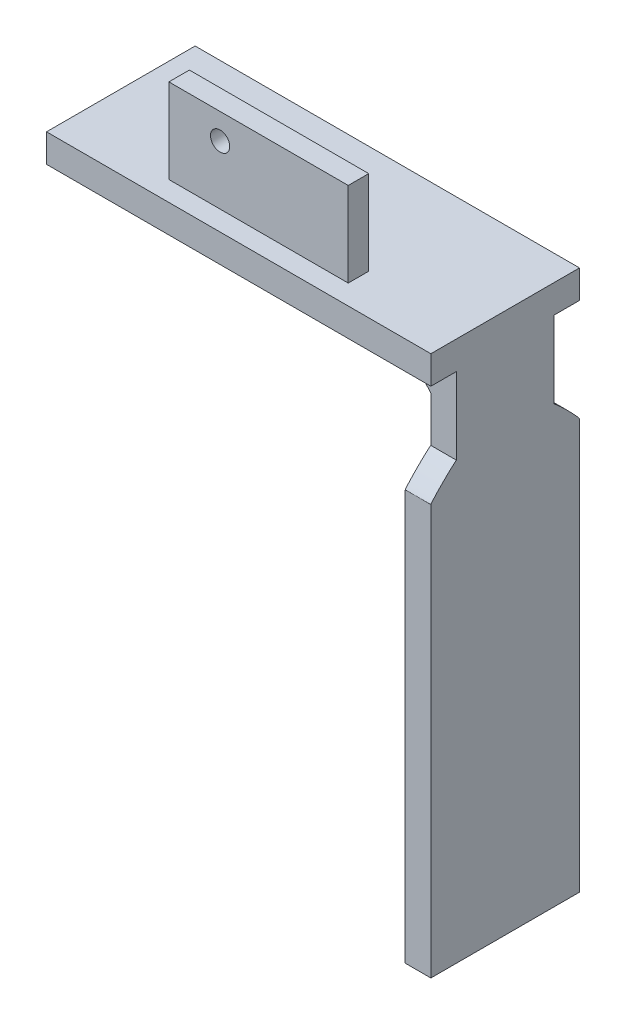
ISO-10303-21;
HEADER;
FILE_DESCRIPTION(('STEP AP214'),'2;1');
FILE_NAME('part.step','',(''),(''),'','','');
FILE_SCHEMA(('AUTOMOTIVE_DESIGN { 1 0 10303 214 1 1 1 1 }'));
ENDSEC;
DATA;
#1=APPLICATION_CONTEXT('core data for automotive mechanical design processes');
#2=APPLICATION_PROTOCOL_DEFINITION('international standard','automotive_design',2000,#1);
#3=PRODUCT_CONTEXT('',#1,'mechanical');
#4=PRODUCT('Part','Part','',(#3));
#5=PRODUCT_RELATED_PRODUCT_CATEGORY('part','',(#4));
#6=PRODUCT_DEFINITION_FORMATION('','',#4);
#7=PRODUCT_DEFINITION_CONTEXT('part definition',#1,'design');
#8=PRODUCT_DEFINITION('design','',#6,#7);
#9=PRODUCT_DEFINITION_SHAPE('','',#8);
#10=(LENGTH_UNIT() NAMED_UNIT(*) SI_UNIT(.MILLI.,.METRE.));
#11=(NAMED_UNIT(*) PLANE_ANGLE_UNIT() SI_UNIT($,.RADIAN.));
#12=(NAMED_UNIT(*) SI_UNIT($,.STERADIAN.) SOLID_ANGLE_UNIT());
#13=UNCERTAINTY_MEASURE_WITH_UNIT(LENGTH_MEASURE(1.E-05),#10,'distance_accuracy_value','');
#14=(GEOMETRIC_REPRESENTATION_CONTEXT(3) GLOBAL_UNCERTAINTY_ASSIGNED_CONTEXT((#13)) GLOBAL_UNIT_ASSIGNED_CONTEXT((#10,
#11,#12)) REPRESENTATION_CONTEXT('',''));
#15=CARTESIAN_POINT('',(0.,0.,0.));
#16=DIRECTION('',(0.,0.,1.));
#17=DIRECTION('',(1.,0.,0.));
#18=AXIS2_PLACEMENT_3D('',#15,#16,#17);
#19=CARTESIAN_POINT('',(0.,0.,0.));
#20=DIRECTION('',(0.,1.,0.));
#21=DIRECTION('',(0.,0.,1.));
#22=AXIS2_PLACEMENT_3D('',#19,#20,#21);
#23=PLANE('',#22);
#24=DIRECTION('',(1.,0.,0.));
#25=VECTOR('',#24,1.);
#26=CARTESIAN_POINT('',(60.,0.,4.));
#27=LINE('',#26,#25);
#28=CARTESIAN_POINT('',(51.,0.,3.99999999999999));
#29=VERTEX_POINT('',#28);
#30=CARTESIAN_POINT('',(60.,0.,4.));
#31=VERTEX_POINT('',#30);
#32=EDGE_CURVE('E186',#29,#31,#27,.T.);
#33=ORIENTED_EDGE('',*,*,#32,.F.);
#34=CARTESIAN_POINT('',(51.,0.,19.96));
#35=CARTESIAN_POINT('',(51.,0.,14.3866666666666));
#36=CARTESIAN_POINT('',(51.,0.,8.81333333333334));
#37=CARTESIAN_POINT('',(51.,0.,3.23999999999999));
#38=(BOUNDED_CURVE() B_SPLINE_CURVE(3,(#34,#35,#36,#37),.UNSPECIFIED.,.F.,
.F.) B_SPLINE_CURVE_WITH_KNOTS((4,4),(-0.000760000000000007,0.01596),
.UNSPECIFIED.) CURVE() GEOMETRIC_REPRESENTATION_ITEM() RATIONAL_B_SPLINE_CURVE((1.,1.,1.,1.)) REPRESENTATION_ITEM(''));
#39=CARTESIAN_POINT('',(51.,0.,19.2));
#40=VERTEX_POINT('',#39);
#41=EDGE_CURVE('E407',#29,#40,#38,.F.);
#42=ORIENTED_EDGE('',*,*,#41,.T.);
#43=DIRECTION('',(-1.,0.,0.));
#44=VECTOR('',#43,1.);
#45=CARTESIAN_POINT('',(60.,0.,19.2));
#46=LINE('',#45,#44);
#47=CARTESIAN_POINT('',(60.,0.,19.2));
#48=VERTEX_POINT('',#47);
#49=EDGE_CURVE('E747',#48,#40,#46,.T.);
#50=ORIENTED_EDGE('',*,*,#49,.F.);
#51=DIRECTION('',(0.,0.,-1.));
#52=VECTOR('',#51,1.);
#53=CARTESIAN_POINT('',(60.,0.,0.));
#54=LINE('',#53,#52);
#55=CARTESIAN_POINT('',(60.,0.,23.2));
#56=VERTEX_POINT('',#55);
#57=EDGE_CURVE('E496',#56,#48,#54,.T.);
#58=ORIENTED_EDGE('',*,*,#57,.F.);
#59=DIRECTION('',(1.,0.,0.));
#60=VECTOR('',#59,1.);
#61=CARTESIAN_POINT('',(0.,0.,23.2));
#62=LINE('',#61,#60);
#63=CARTESIAN_POINT('',(0.,0.,23.2));
#64=VERTEX_POINT('',#63);
#65=EDGE_CURVE('E493',#64,#56,#62,.T.);
#66=ORIENTED_EDGE('',*,*,#65,.F.);
#67=DIRECTION('',(0.,0.,1.));
#68=VECTOR('',#67,1.);
#69=CARTESIAN_POINT('',(0.,0.,0.));
#70=LINE('',#69,#68);
#71=CARTESIAN_POINT('',(0.,0.,0.));
#72=VERTEX_POINT('',#71);
#73=EDGE_CURVE('E479',#72,#64,#70,.T.);
#74=ORIENTED_EDGE('',*,*,#73,.F.);
#75=DIRECTION('',(-1.,0.,0.));
#76=VECTOR('',#75,1.);
#77=CARTESIAN_POINT('',(0.,0.,0.));
#78=LINE('',#77,#76);
#79=CARTESIAN_POINT('',(60.,0.,0.));
#80=VERTEX_POINT('',#79);
#81=EDGE_CURVE('E484',#80,#72,#78,.T.);
#82=ORIENTED_EDGE('',*,*,#81,.F.);
#83=EDGE_CURVE('E495',#31,#80,#54,.T.);
#84=ORIENTED_EDGE('',*,*,#83,.F.);
#85=EDGE_LOOP('',(#33,#42,#50,#58,#66,#74,#82,#84));
#86=FACE_BOUND('',#85,.T.);
#87=ADVANCED_FACE('F38',(#86),#23,.F.);
#88=CARTESIAN_POINT('',(0.,4.4,0.));
#89=DIRECTION('',(0.,1.,0.));
#90=DIRECTION('',(0.,0.,1.));
#91=AXIS2_PLACEMENT_3D('',#88,#89,#90);
#92=PLANE('',#91);
#93=DIRECTION('',(0.,0.,1.));
#94=VECTOR('',#93,1.);
#95=CARTESIAN_POINT('',(0.,4.4,0.));
#96=LINE('',#95,#94);
#97=CARTESIAN_POINT('',(0.,4.4,0.));
#98=VERTEX_POINT('',#97);
#99=CARTESIAN_POINT('',(0.,4.4,23.2));
#100=VERTEX_POINT('',#99);
#101=EDGE_CURVE('E480',#98,#100,#96,.T.);
#102=ORIENTED_EDGE('',*,*,#101,.T.);
#103=DIRECTION('',(1.,0.,0.));
#104=VECTOR('',#103,1.);
#105=CARTESIAN_POINT('',(0.,4.4,23.2));
#106=LINE('',#105,#104);
#107=CARTESIAN_POINT('',(60.,4.4,23.2));
#108=VERTEX_POINT('',#107);
#109=EDGE_CURVE('E483',#100,#108,#106,.T.);
#110=ORIENTED_EDGE('',*,*,#109,.T.);
#111=DIRECTION('',(0.,0.,-1.));
#112=VECTOR('',#111,1.);
#113=CARTESIAN_POINT('',(60.,4.4,0.));
#114=LINE('',#113,#112);
#115=CARTESIAN_POINT('',(60.,4.4,0.));
#116=VERTEX_POINT('',#115);
#117=EDGE_CURVE('E486',#108,#116,#114,.T.);
#118=ORIENTED_EDGE('',*,*,#117,.T.);
#119=DIRECTION('',(-1.,0.,0.));
#120=VECTOR('',#119,1.);
#121=CARTESIAN_POINT('',(0.,4.4,0.));
#122=LINE('',#121,#120);
#123=EDGE_CURVE('E488',#116,#98,#122,.T.);
#124=ORIENTED_EDGE('',*,*,#123,.T.);
#125=EDGE_LOOP('',(#102,#110,#118,#124));
#126=FACE_BOUND('',#125,.T.);
#127=DIRECTION('',(1.,0.,0.));
#128=VECTOR('',#127,1.);
#129=CARTESIAN_POINT('',(16.,4.4,20.1));
#130=LINE('',#129,#128);
#131=CARTESIAN_POINT('',(16.,4.4,20.1));
#132=VERTEX_POINT('',#131);
#133=CARTESIAN_POINT('',(44.,4.4,20.1));
#134=VERTEX_POINT('',#133);
#135=EDGE_CURVE('E452',#132,#134,#130,.T.);
#136=ORIENTED_EDGE('',*,*,#135,.F.);
#137=DIRECTION('',(0.,0.,1.));
#138=VECTOR('',#137,1.);
#139=CARTESIAN_POINT('',(16.,4.4,16.9));
#140=LINE('',#139,#138);
#141=CARTESIAN_POINT('',(16.,4.4,16.9));
#142=VERTEX_POINT('',#141);
#143=EDGE_CURVE('E449',#142,#132,#140,.T.);
#144=ORIENTED_EDGE('',*,*,#143,.F.);
#145=DIRECTION('',(-1.,0.,0.));
#146=VECTOR('',#145,1.);
#147=CARTESIAN_POINT('',(16.,4.4,16.9));
#148=LINE('',#147,#146);
#149=CARTESIAN_POINT('',(44.,4.4,16.9));
#150=VERTEX_POINT('',#149);
#151=EDGE_CURVE('E467',#150,#142,#148,.T.);
#152=ORIENTED_EDGE('',*,*,#151,.F.);
#153=DIRECTION('',(0.,0.,-1.));
#154=VECTOR('',#153,1.);
#155=CARTESIAN_POINT('',(44.,4.4,16.9));
#156=LINE('',#155,#154);
#157=EDGE_CURVE('E459',#134,#150,#156,.T.);
#158=ORIENTED_EDGE('',*,*,#157,.F.);
#159=EDGE_LOOP('',(#136,#144,#152,#158));
#160=FACE_BOUND('',#159,.T.);
#161=ADVANCED_FACE('F420',(#126,#160),#92,.T.);
#162=CARTESIAN_POINT('',(0.,4.4,0.));
#163=DIRECTION('',(1.,0.,0.));
#164=DIRECTION('',(0.,0.,-1.));
#165=AXIS2_PLACEMENT_3D('',#162,#163,#164);
#166=PLANE('',#165);
#167=ORIENTED_EDGE('',*,*,#73,.T.);
#168=DIRECTION('',(0.,-1.,0.));
#169=VECTOR('',#168,1.);
#170=CARTESIAN_POINT('',(0.,4.4,23.2));
#171=LINE('',#170,#169);
#172=EDGE_CURVE('E387',#100,#64,#171,.T.);
#173=ORIENTED_EDGE('',*,*,#172,.F.);
#174=ORIENTED_EDGE('',*,*,#101,.F.);
#175=DIRECTION('',(0.,-1.,0.));
#176=VECTOR('',#175,1.);
#177=CARTESIAN_POINT('',(0.,4.4,0.));
#178=LINE('',#177,#176);
#179=EDGE_CURVE('E490',#98,#72,#178,.T.);
#180=ORIENTED_EDGE('',*,*,#179,.T.);
#181=EDGE_LOOP('',(#167,#173,#174,#180));
#182=FACE_BOUND('',#181,.T.);
#183=ADVANCED_FACE('F628',(#182),#166,.F.);
#184=CARTESIAN_POINT('',(0.,4.4,23.2));
#185=DIRECTION('',(0.,0.,-1.));
#186=DIRECTION('',(-1.,0.,0.));
#187=AXIS2_PLACEMENT_3D('',#184,#185,#186);
#188=PLANE('',#187);
#189=ORIENTED_EDGE('',*,*,#65,.T.);
#190=DIRECTION('',(0.,-1.,0.));
#191=VECTOR('',#190,1.);
#192=CARTESIAN_POINT('',(60.,4.4,23.2));
#193=LINE('',#192,#191);
#194=EDGE_CURVE('E504',#108,#56,#193,.T.);
#195=ORIENTED_EDGE('',*,*,#194,.F.);
#196=ORIENTED_EDGE('',*,*,#109,.F.);
#197=ORIENTED_EDGE('',*,*,#172,.T.);
#198=EDGE_LOOP('',(#189,#195,#196,#197));
#199=FACE_BOUND('',#198,.T.);
#200=ADVANCED_FACE('F430',(#199),#188,.F.);
#201=CARTESIAN_POINT('',(60.,4.4,0.));
#202=DIRECTION('',(-1.,0.,0.));
#203=DIRECTION('',(0.,0.,1.));
#204=AXIS2_PLACEMENT_3D('',#201,#202,#203);
#205=PLANE('',#204);
#206=DIRECTION('',(0.,-1.,0.));
#207=VECTOR('',#206,1.);
#208=CARTESIAN_POINT('',(60.,-80.,0.));
#209=LINE('',#208,#207);
#210=CARTESIAN_POINT('',(60.,-16.,0.));
#211=VERTEX_POINT('',#210);
#212=CARTESIAN_POINT('',(60.,-80.,0.));
#213=VERTEX_POINT('',#212);
#214=EDGE_CURVE('E171',#211,#213,#209,.T.);
#215=ORIENTED_EDGE('',*,*,#214,.F.);
#216=CARTESIAN_POINT('',(60.,-12.,4.));
#217=CARTESIAN_POINT('',(60.,-12.,0.));
#218=CARTESIAN_POINT('',(60.,-16.,0.));
#219=(BOUNDED_CURVE() B_SPLINE_CURVE(2,(#216,#217,#218),.UNSPECIFIED.,.F.,
.F.) B_SPLINE_CURVE_WITH_KNOTS((3,3),(0.,1.),
.UNSPECIFIED.) CURVE() GEOMETRIC_REPRESENTATION_ITEM() RATIONAL_B_SPLINE_CURVE((1.,
0.0526315789473684,1.)) REPRESENTATION_ITEM(''));
#220=CARTESIAN_POINT('',(60.,-12.,4.));
#221=VERTEX_POINT('',#220);
#222=EDGE_CURVE('E51',#211,#221,#219,.F.);
#223=ORIENTED_EDGE('',*,*,#222,.T.);
#224=DIRECTION('',(0.,1.,0.));
#225=VECTOR('',#224,1.);
#226=CARTESIAN_POINT('',(60.,-80.,4.));
#227=LINE('',#226,#225);
#228=EDGE_CURVE('E168',#221,#31,#227,.T.);
#229=ORIENTED_EDGE('',*,*,#228,.T.);
#230=ORIENTED_EDGE('',*,*,#83,.T.);
#231=DIRECTION('',(0.,-1.,0.));
#232=VECTOR('',#231,1.);
#233=CARTESIAN_POINT('',(60.,4.4,0.));
#234=LINE('',#233,#232);
#235=EDGE_CURVE('E502',#116,#80,#234,.T.);
#236=ORIENTED_EDGE('',*,*,#235,.F.);
#237=ORIENTED_EDGE('',*,*,#117,.F.);
#238=ORIENTED_EDGE('',*,*,#194,.T.);
#239=ORIENTED_EDGE('',*,*,#57,.T.);
#240=DIRECTION('',(0.,1.,0.));
#241=VECTOR('',#240,1.);
#242=CARTESIAN_POINT('',(60.,-80.,19.2));
#243=LINE('',#242,#241);
#244=CARTESIAN_POINT('',(60.,-12.,19.2));
#245=VERTEX_POINT('',#244);
#246=EDGE_CURVE('E390',#245,#48,#243,.T.);
#247=ORIENTED_EDGE('',*,*,#246,.F.);
#248=CARTESIAN_POINT('',(60.,-16.,23.2));
#249=CARTESIAN_POINT('',(60.,-12.,23.2));
#250=CARTESIAN_POINT('',(60.,-12.,19.2));
#251=(BOUNDED_CURVE() B_SPLINE_CURVE(2,(#248,#249,#250),.UNSPECIFIED.,.F.,
.F.) B_SPLINE_CURVE_WITH_KNOTS((3,3),(0.,1.),
.UNSPECIFIED.) CURVE() GEOMETRIC_REPRESENTATION_ITEM() RATIONAL_B_SPLINE_CURVE((1.,
0.0526315789473684,1.)) REPRESENTATION_ITEM(''));
#252=CARTESIAN_POINT('',(60.,-16.,23.2));
#253=VERTEX_POINT('',#252);
#254=EDGE_CURVE('E58',#245,#253,#251,.F.);
#255=ORIENTED_EDGE('',*,*,#254,.T.);
#256=DIRECTION('',(0.,1.,0.));
#257=VECTOR('',#256,1.);
#258=CARTESIAN_POINT('',(60.,-80.,23.2));
#259=LINE('',#258,#257);
#260=CARTESIAN_POINT('',(60.,-80.,23.2));
#261=VERTEX_POINT('',#260);
#262=EDGE_CURVE('E353',#261,#253,#259,.T.);
#263=ORIENTED_EDGE('',*,*,#262,.F.);
#264=DIRECTION('',(0.,0.,1.));
#265=VECTOR('',#264,1.);
#266=CARTESIAN_POINT('',(60.,-80.,4.));
#267=LINE('',#266,#265);
#268=EDGE_CURVE('E376',#213,#261,#267,.T.);
#269=ORIENTED_EDGE('',*,*,#268,.F.);
#270=EDGE_LOOP('',(#215,#223,#229,#230,#236,#237,#238,#239,#247,#255,#263,#269));
#271=FACE_BOUND('',#270,.T.);
#272=ADVANCED_FACE('F167',(#271),#205,.F.);
#273=CARTESIAN_POINT('',(0.,4.4,0.));
#274=DIRECTION('',(0.,0.,1.));
#275=DIRECTION('',(1.,0.,0.));
#276=AXIS2_PLACEMENT_3D('',#273,#274,#275);
#277=PLANE('',#276);
#278=ORIENTED_EDGE('',*,*,#81,.T.);
#279=ORIENTED_EDGE('',*,*,#179,.F.);
#280=ORIENTED_EDGE('',*,*,#123,.F.);
#281=ORIENTED_EDGE('',*,*,#235,.T.);
#282=EDGE_LOOP('',(#278,#279,#280,#281));
#283=FACE_BOUND('',#282,.T.);
#284=ADVANCED_FACE('F422',(#283),#277,.F.);
#285=CARTESIAN_POINT('',(16.,17.6,16.9));
#286=DIRECTION('',(1.,0.,0.));
#287=DIRECTION('',(0.,0.,-1.));
#288=AXIS2_PLACEMENT_3D('',#285,#286,#287);
#289=PLANE('',#288);
#290=ORIENTED_EDGE('',*,*,#143,.T.);
#291=DIRECTION('',(0.,-1.,0.));
#292=VECTOR('',#291,1.);
#293=CARTESIAN_POINT('',(16.,17.6,20.1));
#294=LINE('',#293,#292);
#295=CARTESIAN_POINT('',(16.,17.6,20.1));
#296=VERTEX_POINT('',#295);
#297=EDGE_CURVE('E477',#296,#132,#294,.T.);
#298=ORIENTED_EDGE('',*,*,#297,.F.);
#299=DIRECTION('',(0.,0.,1.));
#300=VECTOR('',#299,1.);
#301=CARTESIAN_POINT('',(16.,17.6,16.9));
#302=LINE('',#301,#300);
#303=CARTESIAN_POINT('',(16.,17.6,16.9));
#304=VERTEX_POINT('',#303);
#305=EDGE_CURVE('E469',#304,#296,#302,.T.);
#306=ORIENTED_EDGE('',*,*,#305,.F.);
#307=DIRECTION('',(0.,-1.,0.));
#308=VECTOR('',#307,1.);
#309=CARTESIAN_POINT('',(16.,17.6,16.9));
#310=LINE('',#309,#308);
#311=EDGE_CURVE('E470',#304,#142,#310,.T.);
#312=ORIENTED_EDGE('',*,*,#311,.T.);
#313=EDGE_LOOP('',(#290,#298,#306,#312));
#314=FACE_BOUND('',#313,.T.);
#315=ADVANCED_FACE('F425',(#314),#289,.F.);
#316=CARTESIAN_POINT('',(16.,17.6,20.1));
#317=DIRECTION('',(0.,0.,-1.));
#318=DIRECTION('',(-1.,0.,0.));
#319=AXIS2_PLACEMENT_3D('',#316,#317,#318);
#320=PLANE('',#319);
#321=CARTESIAN_POINT('',(24.,13.6,20.1));
#322=DIRECTION('',(0.,0.,1.));
#323=DIRECTION('',(1.,0.,0.));
#324=AXIS2_PLACEMENT_3D('',#321,#322,#323);
#325=CIRCLE('',#324,1.5);
#326=CARTESIAN_POINT('',(25.5,13.6,20.1));
#327=VERTEX_POINT('',#326);
#328=EDGE_CURVE('E519',#327,#327,#325,.T.);
#329=ORIENTED_EDGE('',*,*,#328,.F.);
#330=EDGE_LOOP('',(#329));
#331=FACE_BOUND('',#330,.T.);
#332=ORIENTED_EDGE('',*,*,#135,.T.);
#333=DIRECTION('',(0.,-1.,0.));
#334=VECTOR('',#333,1.);
#335=CARTESIAN_POINT('',(44.,17.6,20.1));
#336=LINE('',#335,#334);
#337=CARTESIAN_POINT('',(44.,17.6,20.1));
#338=VERTEX_POINT('',#337);
#339=EDGE_CURVE('E474',#338,#134,#336,.T.);
#340=ORIENTED_EDGE('',*,*,#339,.F.);
#341=DIRECTION('',(1.,0.,0.));
#342=VECTOR('',#341,1.);
#343=CARTESIAN_POINT('',(16.,17.6,20.1));
#344=LINE('',#343,#342);
#345=EDGE_CURVE('E766',#296,#338,#344,.T.);
#346=ORIENTED_EDGE('',*,*,#345,.F.);
#347=ORIENTED_EDGE('',*,*,#297,.T.);
#348=EDGE_LOOP('',(#332,#340,#346,#347));
#349=FACE_BOUND('',#348,.T.);
#350=ADVANCED_FACE('F598',(#331,#349),#320,.F.);
#351=CARTESIAN_POINT('',(44.,17.6,16.9));
#352=DIRECTION('',(-1.,0.,0.));
#353=DIRECTION('',(0.,0.,1.));
#354=AXIS2_PLACEMENT_3D('',#351,#352,#353);
#355=PLANE('',#354);
#356=ORIENTED_EDGE('',*,*,#157,.T.);
#357=DIRECTION('',(0.,-1.,0.));
#358=VECTOR('',#357,1.);
#359=CARTESIAN_POINT('',(44.,17.6,16.9));
#360=LINE('',#359,#358);
#361=CARTESIAN_POINT('',(44.,17.6,16.9));
#362=VERTEX_POINT('',#361);
#363=EDGE_CURVE('E472',#362,#150,#360,.T.);
#364=ORIENTED_EDGE('',*,*,#363,.F.);
#365=DIRECTION('',(0.,0.,-1.));
#366=VECTOR('',#365,1.);
#367=CARTESIAN_POINT('',(44.,17.6,16.9));
#368=LINE('',#367,#366);
#369=EDGE_CURVE('E764',#338,#362,#368,.T.);
#370=ORIENTED_EDGE('',*,*,#369,.F.);
#371=ORIENTED_EDGE('',*,*,#339,.T.);
#372=EDGE_LOOP('',(#356,#364,#370,#371));
#373=FACE_BOUND('',#372,.T.);
#374=ADVANCED_FACE('F589',(#373),#355,.F.);
#375=CARTESIAN_POINT('',(16.,17.6,16.9));
#376=DIRECTION('',(0.,0.,1.));
#377=DIRECTION('',(1.,0.,0.));
#378=AXIS2_PLACEMENT_3D('',#375,#376,#377);
#379=PLANE('',#378);
#380=CARTESIAN_POINT('',(24.,13.6,16.9));
#381=DIRECTION('',(0.,0.,1.));
#382=DIRECTION('',(1.,0.,0.));
#383=AXIS2_PLACEMENT_3D('',#380,#381,#382);
#384=CIRCLE('',#383,1.5);
#385=CARTESIAN_POINT('',(25.5,13.6,16.9));
#386=VERTEX_POINT('',#385);
#387=EDGE_CURVE('E46',#386,#386,#384,.T.);
#388=ORIENTED_EDGE('',*,*,#387,.T.);
#389=EDGE_LOOP('',(#388));
#390=FACE_BOUND('',#389,.T.);
#391=ORIENTED_EDGE('',*,*,#151,.T.);
#392=ORIENTED_EDGE('',*,*,#311,.F.);
#393=DIRECTION('',(-1.,0.,0.));
#394=VECTOR('',#393,1.);
#395=CARTESIAN_POINT('',(16.,17.6,16.9));
#396=LINE('',#395,#394);
#397=EDGE_CURVE('E462',#362,#304,#396,.T.);
#398=ORIENTED_EDGE('',*,*,#397,.F.);
#399=ORIENTED_EDGE('',*,*,#363,.T.);
#400=EDGE_LOOP('',(#391,#392,#398,#399));
#401=FACE_BOUND('',#400,.T.);
#402=ADVANCED_FACE('F580',(#390,#401),#379,.F.);
#403=CARTESIAN_POINT('',(0.,17.6,0.));
#404=DIRECTION('',(0.,1.,0.));
#405=DIRECTION('',(0.,0.,1.));
#406=AXIS2_PLACEMENT_3D('',#403,#404,#405);
#407=PLANE('',#406);
#408=ORIENTED_EDGE('',*,*,#305,.T.);
#409=ORIENTED_EDGE('',*,*,#345,.T.);
#410=ORIENTED_EDGE('',*,*,#369,.T.);
#411=ORIENTED_EDGE('',*,*,#397,.T.);
#412=EDGE_LOOP('',(#408,#409,#410,#411));
#413=FACE_BOUND('',#412,.T.);
#414=ADVANCED_FACE('F296',(#413),#407,.T.);
#415=CARTESIAN_POINT('',(60.,-80.,19.2));
#416=DIRECTION('',(0.,0.,-1.));
#417=DIRECTION('',(-1.,0.,0.));
#418=AXIS2_PLACEMENT_3D('',#415,#416,#417);
#419=PLANE('',#418);
#420=DIRECTION('',(0.,1.,0.));
#421=VECTOR('',#420,1.);
#422=CARTESIAN_POINT('',(56.,-80.,19.2));
#423=LINE('',#422,#421);
#424=CARTESIAN_POINT('',(56.,-12.,19.2));
#425=VERTEX_POINT('',#424);
#426=CARTESIAN_POINT('',(56.,-5.,19.2));
#427=VERTEX_POINT('',#426);
#428=EDGE_CURVE('E386',#425,#427,#423,.T.);
#429=ORIENTED_EDGE('',*,*,#428,.F.);
#430=CARTESIAN_POINT('',(60.2,-12.,19.2));
#431=CARTESIAN_POINT('',(58.7333333333333,-12.,19.2));
#432=CARTESIAN_POINT('',(57.2666666666667,-12.,19.2));
#433=CARTESIAN_POINT('',(55.8,-12.,19.2));
#434=(BOUNDED_CURVE() B_SPLINE_CURVE(3,(#430,#431,#432,#433),.UNSPECIFIED.,.F.,
.F.) B_SPLINE_CURVE_WITH_KNOTS((4,4),(-0.0002,0.0042),
.UNSPECIFIED.) CURVE() GEOMETRIC_REPRESENTATION_ITEM() RATIONAL_B_SPLINE_CURVE((1.,1.,1.,1.)) REPRESENTATION_ITEM(''));
#435=EDGE_CURVE('E309',#245,#425,#434,.T.);
#436=ORIENTED_EDGE('',*,*,#435,.F.);
#437=ORIENTED_EDGE('',*,*,#246,.T.);
#438=ORIENTED_EDGE('',*,*,#49,.T.);
#439=CARTESIAN_POINT('',(56.,-5.,19.2));
#440=CARTESIAN_POINT('',(56.,0.,19.2));
#441=CARTESIAN_POINT('',(51.,0.,19.2));
#442=(BOUNDED_CURVE() B_SPLINE_CURVE(2,(#439,#440,#441),.UNSPECIFIED.,.F.,
.F.) B_SPLINE_CURVE_WITH_KNOTS((3,3),(0.,1.),
.UNSPECIFIED.) CURVE() GEOMETRIC_REPRESENTATION_ITEM() RATIONAL_B_SPLINE_CURVE((1.,
0.0526315789473684,1.)) REPRESENTATION_ITEM(''));
#443=EDGE_CURVE('E281',#40,#427,#442,.F.);
#444=ORIENTED_EDGE('',*,*,#443,.T.);
#445=EDGE_LOOP('',(#429,#436,#437,#438,#444));
#446=FACE_BOUND('',#445,.T.);
#447=ADVANCED_FACE('F287',(#446),#419,.F.);
#448=CARTESIAN_POINT('',(56.,-80.,4.));
#449=DIRECTION('',(1.,0.,0.));
#450=DIRECTION('',(0.,0.,-1.));
#451=AXIS2_PLACEMENT_3D('',#448,#449,#450);
#452=PLANE('',#451);
#453=DIRECTION('',(0.,1.,0.));
#454=VECTOR('',#453,1.);
#455=CARTESIAN_POINT('',(56.,-80.,4.));
#456=LINE('',#455,#454);
#457=CARTESIAN_POINT('',(56.,-12.,4.));
#458=VERTEX_POINT('',#457);
#459=CARTESIAN_POINT('',(56.,-5.,4.));
#460=VERTEX_POINT('',#459);
#461=EDGE_CURVE('E187',#458,#460,#456,.T.);
#462=ORIENTED_EDGE('',*,*,#461,.F.);
#463=CARTESIAN_POINT('',(56.,-16.,0.));
#464=CARTESIAN_POINT('',(56.,-12.,0.));
#465=CARTESIAN_POINT('',(56.,-12.,4.));
#466=(BOUNDED_CURVE() B_SPLINE_CURVE(2,(#463,#464,#465),.UNSPECIFIED.,.F.,
.F.) B_SPLINE_CURVE_WITH_KNOTS((3,3),(0.,1.),
.UNSPECIFIED.) CURVE() GEOMETRIC_REPRESENTATION_ITEM() RATIONAL_B_SPLINE_CURVE((1.,
0.0526315789473684,1.)) REPRESENTATION_ITEM(''));
#467=CARTESIAN_POINT('',(56.,-16.,0.));
#468=VERTEX_POINT('',#467);
#469=EDGE_CURVE('E192',#458,#468,#466,.F.);
#470=ORIENTED_EDGE('',*,*,#469,.T.);
#471=DIRECTION('',(0.,-1.,0.));
#472=VECTOR('',#471,1.);
#473=CARTESIAN_POINT('',(56.,-80.,0.));
#474=LINE('',#473,#472);
#475=CARTESIAN_POINT('',(56.,-80.,0.));
#476=VERTEX_POINT('',#475);
#477=EDGE_CURVE('E367',#468,#476,#474,.T.);
#478=ORIENTED_EDGE('',*,*,#477,.T.);
#479=DIRECTION('',(0.,0.,-1.));
#480=VECTOR('',#479,1.);
#481=CARTESIAN_POINT('',(56.,-80.,4.));
#482=LINE('',#481,#480);
#483=CARTESIAN_POINT('',(56.,-80.,23.2));
#484=VERTEX_POINT('',#483);
#485=EDGE_CURVE('E188',#484,#476,#482,.T.);
#486=ORIENTED_EDGE('',*,*,#485,.F.);
#487=DIRECTION('',(0.,1.,0.));
#488=VECTOR('',#487,1.);
#489=CARTESIAN_POINT('',(56.,-80.,23.2));
#490=LINE('',#489,#488);
#491=CARTESIAN_POINT('',(56.,-16.,23.2));
#492=VERTEX_POINT('',#491);
#493=EDGE_CURVE('E352',#484,#492,#490,.T.);
#494=ORIENTED_EDGE('',*,*,#493,.T.);
#495=CARTESIAN_POINT('',(56.,-12.,19.2));
#496=CARTESIAN_POINT('',(56.,-12.,23.2));
#497=CARTESIAN_POINT('',(56.,-16.,23.2));
#498=(BOUNDED_CURVE() B_SPLINE_CURVE(2,(#495,#496,#497),.UNSPECIFIED.,.F.,
.F.) B_SPLINE_CURVE_WITH_KNOTS((3,3),(0.,1.),
.UNSPECIFIED.) CURVE() GEOMETRIC_REPRESENTATION_ITEM() RATIONAL_B_SPLINE_CURVE((1.,
0.0526315789473684,1.)) REPRESENTATION_ITEM(''));
#499=EDGE_CURVE('E345',#492,#425,#498,.F.);
#500=ORIENTED_EDGE('',*,*,#499,.T.);
#501=ORIENTED_EDGE('',*,*,#428,.T.);
#502=CARTESIAN_POINT('',(56.,-5.,3.23999999999999));
#503=CARTESIAN_POINT('',(56.,-5.,8.81333333333334));
#504=CARTESIAN_POINT('',(56.,-5.,14.3866666666666));
#505=CARTESIAN_POINT('',(56.,-5.,19.96));
#506=(BOUNDED_CURVE() B_SPLINE_CURVE(3,(#502,#503,#504,#505),.UNSPECIFIED.,.F.,
.F.) B_SPLINE_CURVE_WITH_KNOTS((4,4),(-0.000760000000000007,0.01596),
.UNSPECIFIED.) CURVE() GEOMETRIC_REPRESENTATION_ITEM() RATIONAL_B_SPLINE_CURVE((1.,1.,1.,1.)) REPRESENTATION_ITEM(''));
#507=EDGE_CURVE('E394',#427,#460,#506,.F.);
#508=ORIENTED_EDGE('',*,*,#507,.T.);
#509=EDGE_LOOP('',(#462,#470,#478,#486,#494,#500,#501,#508));
#510=FACE_BOUND('',#509,.T.);
#511=ADVANCED_FACE('F261',(#510),#452,.F.);
#512=CARTESIAN_POINT('',(60.,-80.,4.));
#513=DIRECTION('',(0.,0.,1.));
#514=DIRECTION('',(1.,0.,0.));
#515=AXIS2_PLACEMENT_3D('',#512,#513,#514);
#516=PLANE('',#515);
#517=ORIENTED_EDGE('',*,*,#228,.F.);
#518=CARTESIAN_POINT('',(55.8,-12.,4.));
#519=CARTESIAN_POINT('',(57.2666666666667,-12.,4.));
#520=CARTESIAN_POINT('',(58.7333333333333,-12.,4.));
#521=CARTESIAN_POINT('',(60.2,-12.,4.));
#522=(BOUNDED_CURVE() B_SPLINE_CURVE(3,(#518,#519,#520,#521),.UNSPECIFIED.,.F.,
.F.) B_SPLINE_CURVE_WITH_KNOTS((4,4),(-0.000200000000000001,0.0042),
.UNSPECIFIED.) CURVE() GEOMETRIC_REPRESENTATION_ITEM() RATIONAL_B_SPLINE_CURVE((1.,1.,1.,1.)) REPRESENTATION_ITEM(''));
#523=EDGE_CURVE('E182',#221,#458,#522,.F.);
#524=ORIENTED_EDGE('',*,*,#523,.T.);
#525=ORIENTED_EDGE('',*,*,#461,.T.);
#526=CARTESIAN_POINT('',(51.,0.,3.99999999999999));
#527=CARTESIAN_POINT('',(56.,0.,4.));
#528=CARTESIAN_POINT('',(56.,-5.,3.99999999999999));
#529=(BOUNDED_CURVE() B_SPLINE_CURVE(2,(#526,#527,#528),.UNSPECIFIED.,.F.,
.F.) B_SPLINE_CURVE_WITH_KNOTS((3,3),(0.,1.),
.UNSPECIFIED.) CURVE() GEOMETRIC_REPRESENTATION_ITEM() RATIONAL_B_SPLINE_CURVE((1.,
0.0526315789473684,1.)) REPRESENTATION_ITEM(''));
#530=EDGE_CURVE('E512',#460,#29,#529,.F.);
#531=ORIENTED_EDGE('',*,*,#530,.T.);
#532=ORIENTED_EDGE('',*,*,#32,.T.);
#533=EDGE_LOOP('',(#517,#524,#525,#531,#532));
#534=FACE_BOUND('',#533,.T.);
#535=ADVANCED_FACE('F180',(#534),#516,.F.);
#536=CARTESIAN_POINT('',(0.,-80.,0.));
#537=DIRECTION('',(0.,-1.,0.));
#538=DIRECTION('',(0.,0.,-1.));
#539=AXIS2_PLACEMENT_3D('',#536,#537,#538);
#540=PLANE('',#539);
#541=ORIENTED_EDGE('',*,*,#268,.T.);
#542=DIRECTION('',(-1.,0.,0.));
#543=VECTOR('',#542,1.);
#544=CARTESIAN_POINT('',(60.,-80.,23.2));
#545=LINE('',#544,#543);
#546=EDGE_CURVE('E361',#261,#484,#545,.T.);
#547=ORIENTED_EDGE('',*,*,#546,.T.);
#548=ORIENTED_EDGE('',*,*,#485,.T.);
#549=DIRECTION('',(-1.,0.,0.));
#550=VECTOR('',#549,1.);
#551=CARTESIAN_POINT('',(60.,-80.,0.));
#552=LINE('',#551,#550);
#553=EDGE_CURVE('E194',#213,#476,#552,.T.);
#554=ORIENTED_EDGE('',*,*,#553,.F.);
#555=EDGE_LOOP('',(#541,#547,#548,#554));
#556=FACE_BOUND('',#555,.T.);
#557=ADVANCED_FACE('F260',(#556),#540,.T.);
#558=CARTESIAN_POINT('',(60.,-80.,23.2));
#559=DIRECTION('',(0.,0.,1.));
#560=DIRECTION('',(1.,0.,0.));
#561=AXIS2_PLACEMENT_3D('',#558,#559,#560);
#562=PLANE('',#561);
#563=ORIENTED_EDGE('',*,*,#262,.T.);
#564=CARTESIAN_POINT('',(55.8,-16.,23.2));
#565=CARTESIAN_POINT('',(57.2666666666667,-16.,23.2));
#566=CARTESIAN_POINT('',(58.7333333333333,-16.,23.2));
#567=CARTESIAN_POINT('',(60.2,-16.,23.2));
#568=(BOUNDED_CURVE() B_SPLINE_CURVE(3,(#564,#565,#566,#567),.UNSPECIFIED.,.F.,
.F.) B_SPLINE_CURVE_WITH_KNOTS((4,4),(-0.000200000000000001,0.0042),
.UNSPECIFIED.) CURVE() GEOMETRIC_REPRESENTATION_ITEM() RATIONAL_B_SPLINE_CURVE((1.,1.,1.,1.)) REPRESENTATION_ITEM(''));
#569=EDGE_CURVE('E12',#253,#492,#568,.F.);
#570=ORIENTED_EDGE('',*,*,#569,.T.);
#571=ORIENTED_EDGE('',*,*,#493,.F.);
#572=ORIENTED_EDGE('',*,*,#546,.F.);
#573=EDGE_LOOP('',(#563,#570,#571,#572));
#574=FACE_BOUND('',#573,.T.);
#575=ADVANCED_FACE('F350',(#574),#562,.T.);
#576=CARTESIAN_POINT('',(60.,-80.,0.));
#577=DIRECTION('',(0.,0.,-1.));
#578=DIRECTION('',(-1.,0.,0.));
#579=AXIS2_PLACEMENT_3D('',#576,#577,#578);
#580=PLANE('',#579);
#581=ORIENTED_EDGE('',*,*,#477,.F.);
#582=CARTESIAN_POINT('',(60.2,-16.,0.));
#583=CARTESIAN_POINT('',(58.7333333333333,-16.,0.));
#584=CARTESIAN_POINT('',(57.2666666666667,-16.,0.));
#585=CARTESIAN_POINT('',(55.8,-16.,0.));
#586=(BOUNDED_CURVE() B_SPLINE_CURVE(3,(#582,#583,#584,#585),.UNSPECIFIED.,.F.,
.F.) B_SPLINE_CURVE_WITH_KNOTS((4,4),(-0.0002,0.0042),
.UNSPECIFIED.) CURVE() GEOMETRIC_REPRESENTATION_ITEM() RATIONAL_B_SPLINE_CURVE((1.,1.,1.,1.)) REPRESENTATION_ITEM(''));
#587=EDGE_CURVE('E67',#468,#211,#586,.F.);
#588=ORIENTED_EDGE('',*,*,#587,.T.);
#589=ORIENTED_EDGE('',*,*,#214,.T.);
#590=ORIENTED_EDGE('',*,*,#553,.T.);
#591=EDGE_LOOP('',(#581,#588,#589,#590));
#592=FACE_BOUND('',#591,.T.);
#593=ADVANCED_FACE('F515',(#592),#580,.T.);
#594=CARTESIAN_POINT('',(51.,0.,3.23999999999999));
#595=CARTESIAN_POINT('',(51.,0.,8.81333333333334));
#596=CARTESIAN_POINT('',(51.,0.,14.3866666666666));
#597=CARTESIAN_POINT('',(51.,0.,19.96));
#598=CARTESIAN_POINT('',(56.,0.,3.23999999999999));
#599=CARTESIAN_POINT('',(56.,0.,8.81333333333334));
#600=CARTESIAN_POINT('',(56.,0.,14.3866666666666));
#601=CARTESIAN_POINT('',(56.,0.,19.96));
#602=CARTESIAN_POINT('',(56.,-5.,3.23999999999999));
#603=CARTESIAN_POINT('',(56.,-5.,8.81333333333334));
#604=CARTESIAN_POINT('',(56.,-5.,14.3866666666666));
#605=CARTESIAN_POINT('',(56.,-5.,19.96));
#606=(BOUNDED_SURFACE() B_SPLINE_SURFACE(2,3,((#594,#595,#596,#597),(#598,#599,#600,#601),(#602,
#603,#604,#605)),.UNSPECIFIED.,.F.,.F.,.F.) B_SPLINE_SURFACE_WITH_KNOTS((3,3),(4,4),(0.,1.),
(-0.000760000000000007,0.01596),
.UNSPECIFIED.) GEOMETRIC_REPRESENTATION_ITEM() RATIONAL_B_SPLINE_SURFACE(((1.,1.,1.,1.),
(0.0526315789473684,0.0526315789473684,0.0526315789473684,0.0526315789473684),(1.,1.,1.,1.))) REPRESENTATION_ITEM('') SURFACE());
#607=ORIENTED_EDGE('',*,*,#443,.F.);
#608=ORIENTED_EDGE('',*,*,#41,.F.);
#609=ORIENTED_EDGE('',*,*,#530,.F.);
#610=ORIENTED_EDGE('',*,*,#507,.F.);
#611=EDGE_LOOP('',(#607,#608,#609,#610));
#612=FACE_BOUND('',#611,.T.);
#613=ADVANCED_FACE('F216',(#612),#606,.T.);
#614=CARTESIAN_POINT('',(60.2,-12.,4.));
#615=CARTESIAN_POINT('',(58.7333333333333,-12.,4.));
#616=CARTESIAN_POINT('',(57.2666666666667,-12.,4.));
#617=CARTESIAN_POINT('',(55.8,-12.,4.));
#618=CARTESIAN_POINT('',(60.2,-12.,0.));
#619=CARTESIAN_POINT('',(58.7333333333332,-12.,0.));
#620=CARTESIAN_POINT('',(57.2666666666668,-12.,0.));
#621=CARTESIAN_POINT('',(55.8,-12.,0.));
#622=CARTESIAN_POINT('',(60.2,-16.,0.));
#623=CARTESIAN_POINT('',(58.7333333333333,-16.,0.));
#624=CARTESIAN_POINT('',(57.2666666666667,-16.,0.));
#625=CARTESIAN_POINT('',(55.8,-16.,0.));
#626=(BOUNDED_SURFACE() B_SPLINE_SURFACE(2,3,((#614,#615,#616,#617),(#618,#619,#620,#621),(#622,
#623,#624,#625)),.UNSPECIFIED.,.F.,.F.,.F.) B_SPLINE_SURFACE_WITH_KNOTS((3,3),(4,4),(0.,1.),
(-0.0002,0.0042),.UNSPECIFIED.) GEOMETRIC_REPRESENTATION_ITEM() RATIONAL_B_SPLINE_SURFACE(((1.,
1.,1.,1.),(0.0526315789473684,0.0526315789473684,0.0526315789473684,0.0526315789473684),(1.,1.,
1.,1.))) REPRESENTATION_ITEM('') SURFACE());
#627=ORIENTED_EDGE('',*,*,#222,.F.);
#628=ORIENTED_EDGE('',*,*,#587,.F.);
#629=ORIENTED_EDGE('',*,*,#469,.F.);
#630=ORIENTED_EDGE('',*,*,#523,.F.);
#631=EDGE_LOOP('',(#627,#628,#629,#630));
#632=FACE_BOUND('',#631,.T.);
#633=ADVANCED_FACE('F191',(#632),#626,.T.);
#634=CARTESIAN_POINT('',(60.2,-16.,23.2));
#635=CARTESIAN_POINT('',(58.7333333333333,-16.,23.2));
#636=CARTESIAN_POINT('',(57.2666666666667,-16.,23.2));
#637=CARTESIAN_POINT('',(55.8,-16.,23.2));
#638=CARTESIAN_POINT('',(60.2,-12.,23.2));
#639=CARTESIAN_POINT('',(58.7333333333332,-12.,23.2));
#640=CARTESIAN_POINT('',(57.2666666666668,-12.,23.2));
#641=CARTESIAN_POINT('',(55.8,-12.,23.2));
#642=CARTESIAN_POINT('',(60.2,-12.,19.2));
#643=CARTESIAN_POINT('',(58.7333333333333,-12.,19.2));
#644=CARTESIAN_POINT('',(57.2666666666667,-12.,19.2));
#645=CARTESIAN_POINT('',(55.8,-12.,19.2));
#646=(BOUNDED_SURFACE() B_SPLINE_SURFACE(2,3,((#634,#635,#636,#637),(#638,#639,#640,#641),(#642,
#643,#644,#645)),.UNSPECIFIED.,.F.,.F.,.F.) B_SPLINE_SURFACE_WITH_KNOTS((3,3),(4,4),(0.,1.),
(-0.0002,0.0042),.UNSPECIFIED.) GEOMETRIC_REPRESENTATION_ITEM() RATIONAL_B_SPLINE_SURFACE(((1.,
1.,1.,1.),(0.0526315789473684,0.0526315789473684,0.0526315789473684,0.0526315789473684),(1.,1.,
1.,1.))) REPRESENTATION_ITEM('') SURFACE());
#647=ORIENTED_EDGE('',*,*,#254,.F.);
#648=ORIENTED_EDGE('',*,*,#435,.T.);
#649=ORIENTED_EDGE('',*,*,#499,.F.);
#650=ORIENTED_EDGE('',*,*,#569,.F.);
#651=EDGE_LOOP('',(#647,#648,#649,#650));
#652=FACE_BOUND('',#651,.T.);
#653=ADVANCED_FACE('F41',(#652),#646,.T.);
#654=CARTESIAN_POINT('',(24.,13.6,10.1));
#655=DIRECTION('',(0.,0.,1.));
#656=DIRECTION('',(1.,0.,0.));
#657=AXIS2_PLACEMENT_3D('',#654,#655,#656);
#658=CYLINDRICAL_SURFACE('',#657,1.5);
#659=ORIENTED_EDGE('',*,*,#328,.T.);
#660=EDGE_LOOP('',(#659));
#661=FACE_BOUND('',#660,.T.);
#662=ORIENTED_EDGE('',*,*,#387,.F.);
#663=EDGE_LOOP('',(#662));
#664=FACE_BOUND('',#663,.T.);
#665=ADVANCED_FACE('F543',(#661,#664),#658,.F.);
#666=CLOSED_SHELL('',(#87,#161,#183,#200,#272,#284,#315,#350,#374,#402,#414,#447,#511,#535,#557,
#575,#593,#613,#633,#653,#665));
#667=MANIFOLD_SOLID_BREP('B2',#666);
#668=ADVANCED_BREP_SHAPE_REPRESENTATION('',(#18,#667),#14);
#669=SHAPE_DEFINITION_REPRESENTATION(#9,#668);
ENDSEC;
END-ISO-10303-21;
